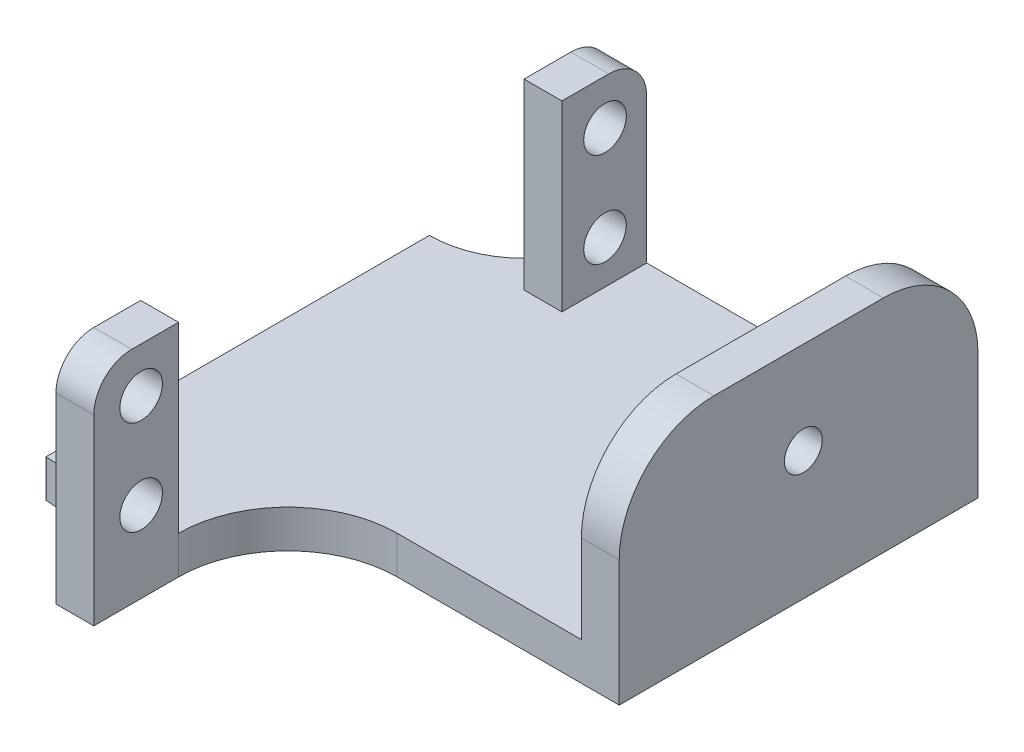
ISO-10303-21;
HEADER;
FILE_DESCRIPTION(('STEP AP214'),'2;1');
FILE_NAME('part.step','',(''),(''),'','','');
FILE_SCHEMA(('AUTOMOTIVE_DESIGN { 1 0 10303 214 1 1 1 1 }'));
ENDSEC;
DATA;
#1=APPLICATION_CONTEXT('core data for automotive mechanical design processes');
#2=APPLICATION_PROTOCOL_DEFINITION('international standard','automotive_design',2000,#1);
#3=PRODUCT_CONTEXT('',#1,'mechanical');
#4=PRODUCT('Part','Part','',(#3));
#5=PRODUCT_RELATED_PRODUCT_CATEGORY('part','',(#4));
#6=PRODUCT_DEFINITION_FORMATION('','',#4);
#7=PRODUCT_DEFINITION_CONTEXT('part definition',#1,'design');
#8=PRODUCT_DEFINITION('design','',#6,#7);
#9=PRODUCT_DEFINITION_SHAPE('','',#8);
#10=(LENGTH_UNIT() NAMED_UNIT(*) SI_UNIT(.MILLI.,.METRE.));
#11=(NAMED_UNIT(*) PLANE_ANGLE_UNIT() SI_UNIT($,.RADIAN.));
#12=(NAMED_UNIT(*) SI_UNIT($,.STERADIAN.) SOLID_ANGLE_UNIT());
#13=UNCERTAINTY_MEASURE_WITH_UNIT(LENGTH_MEASURE(1.E-05),#10,'distance_accuracy_value','');
#14=(GEOMETRIC_REPRESENTATION_CONTEXT(3) GLOBAL_UNCERTAINTY_ASSIGNED_CONTEXT((#13)) GLOBAL_UNIT_ASSIGNED_CONTEXT((#10,
#11,#12)) REPRESENTATION_CONTEXT('',''));
#15=CARTESIAN_POINT('',(0.,0.,0.));
#16=DIRECTION('',(0.,0.,1.));
#17=DIRECTION('',(1.,0.,0.));
#18=AXIS2_PLACEMENT_3D('',#15,#16,#17);
#19=CARTESIAN_POINT('',(0.,4.,0.));
#20=DIRECTION('',(0.,-1.,0.));
#21=DIRECTION('',(0.,0.,-1.));
#22=AXIS2_PLACEMENT_3D('',#19,#20,#21);
#23=PLANE('',#22);
#24=CARTESIAN_POINT('',(-23.45,4.,-8.95));
#25=DIRECTION('',(0.,-1.,0.));
#26=DIRECTION('',(0.,0.,-1.));
#27=AXIS2_PLACEMENT_3D('',#24,#25,#26);
#28=CIRCLE('',#27,11.55);
#29=CARTESIAN_POINT('',(-23.45,4.,-20.5));
#30=VERTEX_POINT('',#29);
#31=CARTESIAN_POINT('',(-35.,4.,-8.95));
#32=VERTEX_POINT('',#31);
#33=EDGE_CURVE('E437',#30,#32,#28,.F.);
#34=ORIENTED_EDGE('',*,*,#33,.F.);
#35=DIRECTION('',(-1.,0.,0.));
#36=VECTOR('',#35,1.);
#37=CARTESIAN_POINT('',(0.,4.,-20.5));
#38=LINE('',#37,#36);
#39=CARTESIAN_POINT('',(-4.,4.,-20.5));
#40=VERTEX_POINT('',#39);
#41=EDGE_CURVE('E211',#40,#30,#38,.T.);
#42=ORIENTED_EDGE('',*,*,#41,.F.);
#43=DIRECTION('',(0.,0.,-1.));
#44=VECTOR('',#43,1.);
#45=CARTESIAN_POINT('',(-4.,4.,0.));
#46=LINE('',#45,#44);
#47=CARTESIAN_POINT('',(-4.,4.,-58.4));
#48=VERTEX_POINT('',#47);
#49=EDGE_CURVE('E333',#40,#48,#46,.T.);
#50=ORIENTED_EDGE('',*,*,#49,.T.);
#51=DIRECTION('',(-1.,0.,0.));
#52=VECTOR('',#51,1.);
#53=CARTESIAN_POINT('',(-39.,4.,-58.4));
#54=LINE('',#53,#52);
#55=CARTESIAN_POINT('',(-35.,4.,-58.4));
#56=VERTEX_POINT('',#55);
#57=EDGE_CURVE('E401',#48,#56,#54,.T.);
#58=ORIENTED_EDGE('',*,*,#57,.T.);
#59=DIRECTION('',(0.,0.,1.));
#60=VECTOR('',#59,1.);
#61=CARTESIAN_POINT('',(-35.,4.,-58.4));
#62=LINE('',#61,#60);
#63=CARTESIAN_POINT('',(-35.,4.,-49.45));
#64=VERTEX_POINT('',#63);
#65=EDGE_CURVE('E352',#56,#64,#62,.T.);
#66=ORIENTED_EDGE('',*,*,#65,.T.);
#67=DIRECTION('',(-1.,0.,0.));
#68=VECTOR('',#67,1.);
#69=CARTESIAN_POINT('',(-35.,4.,-49.45));
#70=LINE('',#69,#68);
#71=CARTESIAN_POINT('',(-39.,4.,-49.45));
#72=VERTEX_POINT('',#71);
#73=EDGE_CURVE('E361',#64,#72,#70,.T.);
#74=ORIENTED_EDGE('',*,*,#73,.T.);
#75=DIRECTION('',(0.,0.,1.));
#76=VECTOR('',#75,1.);
#77=CARTESIAN_POINT('',(-39.,4.,0.));
#78=LINE('',#77,#76);
#79=CARTESIAN_POINT('',(-39.,4.,-58.4));
#80=VERTEX_POINT('',#79);
#81=EDGE_CURVE('E255',#80,#72,#78,.T.);
#82=ORIENTED_EDGE('',*,*,#81,.F.);
#83=CARTESIAN_POINT('',(-48.9447222183428,4.,-59.45));
#84=DIRECTION('',(0.,-1.,0.));
#85=DIRECTION('',(0.,0.,-1.));
#86=AXIS2_PLACEMENT_3D('',#83,#84,#85);
#87=CIRCLE('',#86,10.);
#88=CARTESIAN_POINT('',(-48.9447222183428,4.,-49.45));
#89=VERTEX_POINT('',#88);
#90=EDGE_CURVE('E264',#80,#89,#87,.T.);
#91=ORIENTED_EDGE('',*,*,#90,.T.);
#92=DIRECTION('',(-1.,0.,0.));
#93=VECTOR('',#92,1.);
#94=CARTESIAN_POINT('',(-49.,4.,-49.45));
#95=LINE('',#94,#93);
#96=CARTESIAN_POINT('',(-49.,4.,-49.45));
#97=VERTEX_POINT('',#96);
#98=EDGE_CURVE('E237',#89,#97,#95,.T.);
#99=ORIENTED_EDGE('',*,*,#98,.T.);
#100=DIRECTION('',(0.,0.,1.));
#101=VECTOR('',#100,1.);
#102=CARTESIAN_POINT('',(-49.,4.,-8.94999999999999));
#103=LINE('',#102,#101);
#104=CARTESIAN_POINT('',(-49.,4.,-8.94999999999999));
#105=VERTEX_POINT('',#104);
#106=EDGE_CURVE('E232',#97,#105,#103,.T.);
#107=ORIENTED_EDGE('',*,*,#106,.T.);
#108=DIRECTION('',(1.,0.,0.));
#109=VECTOR('',#108,1.);
#110=CARTESIAN_POINT('',(-39.,4.,-8.95));
#111=LINE('',#110,#109);
#112=CARTESIAN_POINT('',(-48.9447222183428,4.,-8.94999999999999));
#113=VERTEX_POINT('',#112);
#114=EDGE_CURVE('E398',#105,#113,#111,.T.);
#115=ORIENTED_EDGE('',*,*,#114,.T.);
#116=CARTESIAN_POINT('',(-48.9447222183428,4.,1.05000000000001));
#117=DIRECTION('',(0.,-1.,0.));
#118=DIRECTION('',(0.,0.,-1.));
#119=AXIS2_PLACEMENT_3D('',#116,#117,#118);
#120=CIRCLE('',#119,10.);
#121=CARTESIAN_POINT('',(-39.,4.,0.));
#122=VERTEX_POINT('',#121);
#123=EDGE_CURVE('E259',#113,#122,#120,.T.);
#124=ORIENTED_EDGE('',*,*,#123,.T.);
#125=DIRECTION('',(0.,0.,1.));
#126=VECTOR('',#125,1.);
#127=CARTESIAN_POINT('',(-39.,4.,0.));
#128=LINE('',#127,#126);
#129=CARTESIAN_POINT('',(-39.,4.,-8.95));
#130=VERTEX_POINT('',#129);
#131=EDGE_CURVE('E247',#130,#122,#128,.T.);
#132=ORIENTED_EDGE('',*,*,#131,.F.);
#133=DIRECTION('',(-1.,0.,0.));
#134=VECTOR('',#133,1.);
#135=CARTESIAN_POINT('',(-35.,4.,-8.95));
#136=LINE('',#135,#134);
#137=EDGE_CURVE('E387',#32,#130,#136,.T.);
#138=ORIENTED_EDGE('',*,*,#137,.F.);
#139=EDGE_LOOP('',(#34,#42,#50,#58,#66,#74,#82,#91,#99,#107,#115,#124,#132,#138));
#140=FACE_BOUND('',#139,.T.);
#141=ADVANCED_FACE('F34',(#140),#23,.F.);
#142=CARTESIAN_POINT('',(-49.,4.,-8.94999999999999));
#143=DIRECTION('',(1.,0.,0.));
#144=DIRECTION('',(0.,0.,-1.));
#145=AXIS2_PLACEMENT_3D('',#142,#143,#144);
#146=PLANE('',#145);
#147=DIRECTION('',(0.,0.,1.));
#148=VECTOR('',#147,1.);
#149=CARTESIAN_POINT('',(-49.,0.,-8.94999999999999));
#150=LINE('',#149,#148);
#151=CARTESIAN_POINT('',(-49.,0.,-49.45));
#152=VERTEX_POINT('',#151);
#153=CARTESIAN_POINT('',(-49.,0.,-8.94999999999999));
#154=VERTEX_POINT('',#153);
#155=EDGE_CURVE('E224',#152,#154,#150,.T.);
#156=ORIENTED_EDGE('',*,*,#155,.T.);
#157=DIRECTION('',(0.,-1.,0.));
#158=VECTOR('',#157,1.);
#159=CARTESIAN_POINT('',(-49.,4.,-8.94999999999999));
#160=LINE('',#159,#158);
#161=EDGE_CURVE('E244',#105,#154,#160,.T.);
#162=ORIENTED_EDGE('',*,*,#161,.F.);
#163=ORIENTED_EDGE('',*,*,#106,.F.);
#164=DIRECTION('',(0.,-1.,0.));
#165=VECTOR('',#164,1.);
#166=CARTESIAN_POINT('',(-49.,4.,-49.45));
#167=LINE('',#166,#165);
#168=EDGE_CURVE('E233',#97,#152,#167,.T.);
#169=ORIENTED_EDGE('',*,*,#168,.T.);
#170=EDGE_LOOP('',(#156,#162,#163,#169));
#171=FACE_BOUND('',#170,.T.);
#172=ADVANCED_FACE('F407',(#171),#146,.F.);
#173=CARTESIAN_POINT('',(-39.,4.,-8.95));
#174=DIRECTION('',(0.,0.,-1.));
#175=DIRECTION('',(-1.,0.,0.));
#176=AXIS2_PLACEMENT_3D('',#173,#174,#175);
#177=PLANE('',#176);
#178=DIRECTION('',(1.,0.,0.));
#179=VECTOR('',#178,1.);
#180=CARTESIAN_POINT('',(-39.,0.,-8.95));
#181=LINE('',#180,#179);
#182=CARTESIAN_POINT('',(-48.9447222183428,0.,-8.94999999999999));
#183=VERTEX_POINT('',#182);
#184=EDGE_CURVE('E218',#154,#183,#181,.T.);
#185=ORIENTED_EDGE('',*,*,#184,.T.);
#186=DIRECTION('',(0.,1.,0.));
#187=VECTOR('',#186,1.);
#188=CARTESIAN_POINT('',(-48.9447222183428,4.,-8.94999999999999));
#189=LINE('',#188,#187);
#190=EDGE_CURVE('E250',#183,#113,#189,.T.);
#191=ORIENTED_EDGE('',*,*,#190,.T.);
#192=ORIENTED_EDGE('',*,*,#114,.F.);
#193=ORIENTED_EDGE('',*,*,#161,.T.);
#194=EDGE_LOOP('',(#185,#191,#192,#193));
#195=FACE_BOUND('',#194,.T.);
#196=ADVANCED_FACE('F413',(#195),#177,.F.);
#197=CARTESIAN_POINT('',(-39.,4.,0.));
#198=DIRECTION('',(1.,0.,0.));
#199=DIRECTION('',(0.,0.,-1.));
#200=AXIS2_PLACEMENT_3D('',#197,#198,#199);
#201=PLANE('',#200);
#202=DIRECTION('',(0.,-1.,0.));
#203=VECTOR('',#202,1.);
#204=CARTESIAN_POINT('',(-39.,4.,0.));
#205=LINE('',#204,#203);
#206=CARTESIAN_POINT('',(-39.,19.3,0.));
#207=VERTEX_POINT('',#206);
#208=EDGE_CURVE('E242',#207,#122,#205,.T.);
#209=ORIENTED_EDGE('',*,*,#208,.F.);
#210=CARTESIAN_POINT('',(-39.,19.3,-3.99999999999999));
#211=DIRECTION('',(1.,0.,0.));
#212=DIRECTION('',(0.,0.,-1.));
#213=AXIS2_PLACEMENT_3D('',#210,#211,#212);
#214=CIRCLE('',#213,4.);
#215=CARTESIAN_POINT('',(-39.,23.3,-3.99999999999999));
#216=VERTEX_POINT('',#215);
#217=EDGE_CURVE('E277',#207,#216,#214,.F.);
#218=ORIENTED_EDGE('',*,*,#217,.T.);
#219=DIRECTION('',(0.,0.,-1.));
#220=VECTOR('',#219,1.);
#221=CARTESIAN_POINT('',(-39.,23.3,-8.95));
#222=LINE('',#221,#220);
#223=CARTESIAN_POINT('',(-39.,23.3,-8.95));
#224=VERTEX_POINT('',#223);
#225=EDGE_CURVE('E384',#216,#224,#222,.T.);
#226=ORIENTED_EDGE('',*,*,#225,.T.);
#227=DIRECTION('',(0.,-1.,0.));
#228=VECTOR('',#227,1.);
#229=CARTESIAN_POINT('',(-39.,23.3,-8.95));
#230=LINE('',#229,#228);
#231=EDGE_CURVE('E380',#224,#130,#230,.T.);
#232=ORIENTED_EDGE('',*,*,#231,.T.);
#233=ORIENTED_EDGE('',*,*,#131,.T.);
#234=EDGE_LOOP('',(#209,#218,#226,#232,#233));
#235=FACE_BOUND('',#234,.T.);
#236=CARTESIAN_POINT('',(-39.,8.55,-4.99999999999999));
#237=DIRECTION('',(-1.,0.,0.));
#238=DIRECTION('',(0.,0.,1.));
#239=AXIS2_PLACEMENT_3D('',#236,#237,#238);
#240=CIRCLE('',#239,2.25);
#241=CARTESIAN_POINT('',(-39.,8.55,-2.74999999999999));
#242=VERTEX_POINT('',#241);
#243=EDGE_CURVE('E368',#242,#242,#240,.T.);
#244=ORIENTED_EDGE('',*,*,#243,.F.);
#245=EDGE_LOOP('',(#244));
#246=FACE_BOUND('',#245,.T.);
#247=CARTESIAN_POINT('',(-39.,18.55,-4.99999999999999));
#248=DIRECTION('',(-1.,0.,0.));
#249=DIRECTION('',(0.,0.,1.));
#250=AXIS2_PLACEMENT_3D('',#247,#248,#249);
#251=CIRCLE('',#250,2.25);
#252=CARTESIAN_POINT('',(-39.,18.55,-2.74999999999999));
#253=VERTEX_POINT('',#252);
#254=EDGE_CURVE('E374',#253,#253,#251,.T.);
#255=ORIENTED_EDGE('',*,*,#254,.F.);
#256=EDGE_LOOP('',(#255));
#257=FACE_BOUND('',#256,.T.);
#258=ADVANCED_FACE('F449',(#235,#246,#257),#201,.F.);
#259=CARTESIAN_POINT('',(0.,4.,0.));
#260=DIRECTION('',(0.,0.,-1.));
#261=DIRECTION('',(-1.,0.,0.));
#262=AXIS2_PLACEMENT_3D('',#259,#260,#261);
#263=PLANE('',#262);
#264=DIRECTION('',(1.,0.,0.));
#265=VECTOR('',#264,1.);
#266=CARTESIAN_POINT('',(0.,0.,0.));
#267=LINE('',#266,#265);
#268=CARTESIAN_POINT('',(-39.,0.,0.));
#269=VERTEX_POINT('',#268);
#270=CARTESIAN_POINT('',(-35.,0.,0.));
#271=VERTEX_POINT('',#270);
#272=EDGE_CURVE('E208',#269,#271,#267,.T.);
#273=ORIENTED_EDGE('',*,*,#272,.T.);
#274=DIRECTION('',(0.,1.,0.));
#275=VECTOR('',#274,1.);
#276=CARTESIAN_POINT('',(-35.,23.3,0.));
#277=LINE('',#276,#275);
#278=CARTESIAN_POINT('',(-35.,19.3,0.));
#279=VERTEX_POINT('',#278);
#280=EDGE_CURVE('E189',#271,#279,#277,.T.);
#281=ORIENTED_EDGE('',*,*,#280,.T.);
#282=DIRECTION('',(-1.,0.,0.));
#283=VECTOR('',#282,1.);
#284=CARTESIAN_POINT('',(-39.,19.3,0.));
#285=LINE('',#284,#283);
#286=EDGE_CURVE('E275',#279,#207,#285,.T.);
#287=ORIENTED_EDGE('',*,*,#286,.T.);
#288=ORIENTED_EDGE('',*,*,#208,.T.);
#289=EDGE_CURVE('E216',#122,#269,#205,.T.);
#290=ORIENTED_EDGE('',*,*,#289,.T.);
#291=EDGE_LOOP('',(#273,#281,#287,#288,#290));
#292=FACE_BOUND('',#291,.T.);
#293=ADVANCED_FACE('F214',(#292),#263,.F.);
#294=CARTESIAN_POINT('',(0.,4.,-58.4));
#295=DIRECTION('',(-1.,0.,0.));
#296=DIRECTION('',(0.,0.,1.));
#297=AXIS2_PLACEMENT_3D('',#294,#295,#296);
#298=PLANE('',#297);
#299=DIRECTION('',(0.,0.,1.));
#300=VECTOR('',#299,1.);
#301=CARTESIAN_POINT('',(0.,23.3,0.));
#302=LINE('',#301,#300);
#303=CARTESIAN_POINT('',(0.,23.3,-48.4));
#304=VERTEX_POINT('',#303);
#305=CARTESIAN_POINT('',(0.,23.3,-30.5));
#306=VERTEX_POINT('',#305);
#307=EDGE_CURVE('E314',#304,#306,#302,.T.);
#308=ORIENTED_EDGE('',*,*,#307,.T.);
#309=CARTESIAN_POINT('',(0.,13.3,-30.5));
#310=DIRECTION('',(-1.,0.,0.));
#311=DIRECTION('',(0.,0.,1.));
#312=AXIS2_PLACEMENT_3D('',#309,#310,#311);
#313=CIRCLE('',#312,10.);
#314=CARTESIAN_POINT('',(0.,13.3,-20.5));
#315=VERTEX_POINT('',#314);
#316=EDGE_CURVE('E289',#306,#315,#313,.F.);
#317=ORIENTED_EDGE('',*,*,#316,.T.);
#318=DIRECTION('',(0.,-1.,0.));
#319=VECTOR('',#318,1.);
#320=CARTESIAN_POINT('',(0.,23.301,-20.5));
#321=LINE('',#320,#319);
#322=CARTESIAN_POINT('',(0.,0.,-20.5));
#323=VERTEX_POINT('',#322);
#324=EDGE_CURVE('E312',#315,#323,#321,.T.);
#325=ORIENTED_EDGE('',*,*,#324,.T.);
#326=DIRECTION('',(0.,0.,-1.));
#327=VECTOR('',#326,1.);
#328=CARTESIAN_POINT('',(0.,0.,-58.4));
#329=LINE('',#328,#327);
#330=CARTESIAN_POINT('',(0.,0.,-58.4));
#331=VERTEX_POINT('',#330);
#332=EDGE_CURVE('E217',#323,#331,#329,.T.);
#333=ORIENTED_EDGE('',*,*,#332,.T.);
#334=DIRECTION('',(0.,-1.,0.));
#335=VECTOR('',#334,1.);
#336=CARTESIAN_POINT('',(0.,4.,-58.4));
#337=LINE('',#336,#335);
#338=CARTESIAN_POINT('',(0.,13.3,-58.4));
#339=VERTEX_POINT('',#338);
#340=EDGE_CURVE('E240',#339,#331,#337,.T.);
#341=ORIENTED_EDGE('',*,*,#340,.F.);
#342=CARTESIAN_POINT('',(0.,13.3,-48.4));
#343=DIRECTION('',(-1.,0.,0.));
#344=DIRECTION('',(0.,0.,1.));
#345=AXIS2_PLACEMENT_3D('',#342,#343,#344);
#346=CIRCLE('',#345,10.);
#347=EDGE_CURVE('E287',#339,#304,#346,.F.);
#348=ORIENTED_EDGE('',*,*,#347,.T.);
#349=EDGE_LOOP('',(#308,#317,#325,#333,#341,#348));
#350=FACE_BOUND('',#349,.T.);
#351=CARTESIAN_POINT('',(0.,13.55,-39.95));
#352=DIRECTION('',(1.,0.,0.));
#353=DIRECTION('',(0.,0.,-1.));
#354=AXIS2_PLACEMENT_3D('',#351,#352,#353);
#355=CIRCLE('',#354,2.);
#356=CARTESIAN_POINT('',(0.,13.55,-41.95));
#357=VERTEX_POINT('',#356);
#358=EDGE_CURVE('E320',#357,#357,#355,.T.);
#359=ORIENTED_EDGE('',*,*,#358,.F.);
#360=EDGE_LOOP('',(#359));
#361=FACE_BOUND('',#360,.T.);
#362=ADVANCED_FACE('F310',(#350,#361),#298,.F.);
#363=CARTESIAN_POINT('',(-39.,4.,-58.4));
#364=DIRECTION('',(0.,0.,1.));
#365=DIRECTION('',(1.,0.,0.));
#366=AXIS2_PLACEMENT_3D('',#363,#364,#365);
#367=PLANE('',#366);
#368=DIRECTION('',(0.,1.,0.));
#369=VECTOR('',#368,1.);
#370=CARTESIAN_POINT('',(-4.,23.3,-58.4));
#371=LINE('',#370,#369);
#372=CARTESIAN_POINT('',(-4.,13.3,-58.4));
#373=VERTEX_POINT('',#372);
#374=EDGE_CURVE('E306',#48,#373,#371,.T.);
#375=ORIENTED_EDGE('',*,*,#374,.T.);
#376=DIRECTION('',(1.,0.,0.));
#377=VECTOR('',#376,1.);
#378=CARTESIAN_POINT('',(0.,13.3,-58.4));
#379=LINE('',#378,#377);
#380=EDGE_CURVE('E11',#373,#339,#379,.T.);
#381=ORIENTED_EDGE('',*,*,#380,.T.);
#382=ORIENTED_EDGE('',*,*,#340,.T.);
#383=DIRECTION('',(-1.,0.,0.));
#384=VECTOR('',#383,1.);
#385=CARTESIAN_POINT('',(-39.,0.,-58.4));
#386=LINE('',#385,#384);
#387=CARTESIAN_POINT('',(-39.,0.,-58.4));
#388=VERTEX_POINT('',#387);
#389=EDGE_CURVE('E221',#331,#388,#386,.T.);
#390=ORIENTED_EDGE('',*,*,#389,.T.);
#391=DIRECTION('',(0.,-1.,0.));
#392=VECTOR('',#391,1.);
#393=CARTESIAN_POINT('',(-39.,4.,-58.4));
#394=LINE('',#393,#392);
#395=EDGE_CURVE('E236',#80,#388,#394,.T.);
#396=ORIENTED_EDGE('',*,*,#395,.F.);
#397=CARTESIAN_POINT('',(-39.,19.3,-58.4));
#398=VERTEX_POINT('',#397);
#399=EDGE_CURVE('E238',#398,#80,#394,.T.);
#400=ORIENTED_EDGE('',*,*,#399,.F.);
#401=DIRECTION('',(-1.,0.,0.));
#402=VECTOR('',#401,1.);
#403=CARTESIAN_POINT('',(-35.,19.3,-58.4));
#404=LINE('',#403,#402);
#405=CARTESIAN_POINT('',(-35.,19.3,-58.4));
#406=VERTEX_POINT('',#405);
#407=EDGE_CURVE('E271',#398,#406,#404,.F.);
#408=ORIENTED_EDGE('',*,*,#407,.T.);
#409=DIRECTION('',(0.,-1.,0.));
#410=VECTOR('',#409,1.);
#411=CARTESIAN_POINT('',(-35.,23.3,-58.4));
#412=LINE('',#411,#410);
#413=EDGE_CURVE('E349',#406,#56,#412,.T.);
#414=ORIENTED_EDGE('',*,*,#413,.T.);
#415=ORIENTED_EDGE('',*,*,#57,.F.);
#416=EDGE_LOOP('',(#375,#381,#382,#390,#396,#400,#408,#414,#415));
#417=FACE_BOUND('',#416,.T.);
#418=ADVANCED_FACE('F429',(#417),#367,.F.);
#419=CARTESIAN_POINT('',(-39.,4.,-49.45));
#420=DIRECTION('',(1.,0.,0.));
#421=DIRECTION('',(0.,0.,-1.));
#422=AXIS2_PLACEMENT_3D('',#419,#420,#421);
#423=PLANE('',#422);
#424=DIRECTION('',(0.,0.,-1.));
#425=VECTOR('',#424,1.);
#426=CARTESIAN_POINT('',(-39.,23.3,-58.4));
#427=LINE('',#426,#425);
#428=CARTESIAN_POINT('',(-39.,23.3,-49.45));
#429=VERTEX_POINT('',#428);
#430=CARTESIAN_POINT('',(-39.,23.3,-54.4));
#431=VERTEX_POINT('',#430);
#432=EDGE_CURVE('E353',#429,#431,#427,.T.);
#433=ORIENTED_EDGE('',*,*,#432,.T.);
#434=CARTESIAN_POINT('',(-39.,19.3,-54.4));
#435=DIRECTION('',(1.,0.,0.));
#436=DIRECTION('',(0.,0.,-1.));
#437=AXIS2_PLACEMENT_3D('',#434,#435,#436);
#438=CIRCLE('',#437,4.);
#439=EDGE_CURVE('E269',#431,#398,#438,.F.);
#440=ORIENTED_EDGE('',*,*,#439,.T.);
#441=ORIENTED_EDGE('',*,*,#399,.T.);
#442=ORIENTED_EDGE('',*,*,#81,.T.);
#443=DIRECTION('',(0.,1.,0.));
#444=VECTOR('',#443,1.);
#445=CARTESIAN_POINT('',(-39.,23.3,-49.45));
#446=LINE('',#445,#444);
#447=EDGE_CURVE('E346',#72,#429,#446,.T.);
#448=ORIENTED_EDGE('',*,*,#447,.T.);
#449=EDGE_LOOP('',(#433,#440,#441,#442,#448));
#450=FACE_BOUND('',#449,.T.);
#451=CARTESIAN_POINT('',(-39.,8.55,-54.));
#452=DIRECTION('',(-1.,0.,0.));
#453=DIRECTION('',(0.,0.,1.));
#454=AXIS2_PLACEMENT_3D('',#451,#452,#453);
#455=CIRCLE('',#454,2.25);
#456=CARTESIAN_POINT('',(-39.,8.55,-51.75));
#457=VERTEX_POINT('',#456);
#458=EDGE_CURVE('E305',#457,#457,#455,.T.);
#459=ORIENTED_EDGE('',*,*,#458,.F.);
#460=EDGE_LOOP('',(#459));
#461=FACE_BOUND('',#460,.T.);
#462=CARTESIAN_POINT('',(-39.,18.55,-54.));
#463=DIRECTION('',(-1.,0.,0.));
#464=DIRECTION('',(0.,0.,1.));
#465=AXIS2_PLACEMENT_3D('',#462,#463,#464);
#466=CIRCLE('',#465,2.25);
#467=CARTESIAN_POINT('',(-39.,18.55,-51.75));
#468=VERTEX_POINT('',#467);
#469=EDGE_CURVE('E340',#468,#468,#466,.T.);
#470=ORIENTED_EDGE('',*,*,#469,.F.);
#471=EDGE_LOOP('',(#470));
#472=FACE_BOUND('',#471,.T.);
#473=ADVANCED_FACE('F480',(#450,#461,#472),#423,.F.);
#474=CARTESIAN_POINT('',(-49.,4.,-49.45));
#475=DIRECTION('',(0.,0.,1.));
#476=DIRECTION('',(1.,0.,0.));
#477=AXIS2_PLACEMENT_3D('',#474,#475,#476);
#478=PLANE('',#477);
#479=ORIENTED_EDGE('',*,*,#98,.F.);
#480=DIRECTION('',(0.,-1.,0.));
#481=VECTOR('',#480,1.);
#482=CARTESIAN_POINT('',(-48.9447222183428,4.,-49.45));
#483=LINE('',#482,#481);
#484=CARTESIAN_POINT('',(-48.9447222183428,0.,-49.45));
#485=VERTEX_POINT('',#484);
#486=EDGE_CURVE('E252',#89,#485,#483,.T.);
#487=ORIENTED_EDGE('',*,*,#486,.T.);
#488=DIRECTION('',(-1.,0.,0.));
#489=VECTOR('',#488,1.);
#490=CARTESIAN_POINT('',(-49.,0.,-49.45));
#491=LINE('',#490,#489);
#492=EDGE_CURVE('E230',#485,#152,#491,.T.);
#493=ORIENTED_EDGE('',*,*,#492,.T.);
#494=ORIENTED_EDGE('',*,*,#168,.F.);
#495=EDGE_LOOP('',(#479,#487,#493,#494));
#496=FACE_BOUND('',#495,.T.);
#497=ADVANCED_FACE('F422',(#496),#478,.F.);
#498=CARTESIAN_POINT('',(0.,0.,0.));
#499=DIRECTION('',(0.,-1.,0.));
#500=DIRECTION('',(0.,0.,-1.));
#501=AXIS2_PLACEMENT_3D('',#498,#499,#500);
#502=PLANE('',#501);
#503=DIRECTION('',(1.,0.,0.));
#504=VECTOR('',#503,1.);
#505=CARTESIAN_POINT('',(0.,0.,-20.5));
#506=LINE('',#505,#504);
#507=CARTESIAN_POINT('',(-23.45,0.,-20.5));
#508=VERTEX_POINT('',#507);
#509=EDGE_CURVE('E316',#508,#323,#506,.T.);
#510=ORIENTED_EDGE('',*,*,#509,.F.);
#511=CARTESIAN_POINT('',(-23.45,0.,-8.95));
#512=DIRECTION('',(0.,-1.,0.));
#513=DIRECTION('',(0.,0.,-1.));
#514=AXIS2_PLACEMENT_3D('',#511,#512,#513);
#515=CIRCLE('',#514,11.55);
#516=CARTESIAN_POINT('',(-35.,0.,-8.95));
#517=VERTEX_POINT('',#516);
#518=EDGE_CURVE('E210',#517,#508,#515,.T.);
#519=ORIENTED_EDGE('',*,*,#518,.F.);
#520=DIRECTION('',(0.,0.,-1.));
#521=VECTOR('',#520,1.);
#522=CARTESIAN_POINT('',(-35.,0.,0.));
#523=LINE('',#522,#521);
#524=EDGE_CURVE('E193',#271,#517,#523,.T.);
#525=ORIENTED_EDGE('',*,*,#524,.F.);
#526=ORIENTED_EDGE('',*,*,#272,.F.);
#527=CARTESIAN_POINT('',(-48.9447222183428,0.,1.05000000000001));
#528=DIRECTION('',(0.,-1.,0.));
#529=DIRECTION('',(0.,0.,-1.));
#530=AXIS2_PLACEMENT_3D('',#527,#528,#529);
#531=CIRCLE('',#530,10.);
#532=EDGE_CURVE('E257',#269,#183,#531,.F.);
#533=ORIENTED_EDGE('',*,*,#532,.T.);
#534=ORIENTED_EDGE('',*,*,#184,.F.);
#535=ORIENTED_EDGE('',*,*,#155,.F.);
#536=ORIENTED_EDGE('',*,*,#492,.F.);
#537=CARTESIAN_POINT('',(-48.9447222183428,0.,-59.45));
#538=DIRECTION('',(0.,-1.,0.));
#539=DIRECTION('',(0.,0.,-1.));
#540=AXIS2_PLACEMENT_3D('',#537,#538,#539);
#541=CIRCLE('',#540,10.);
#542=EDGE_CURVE('E262',#485,#388,#541,.F.);
#543=ORIENTED_EDGE('',*,*,#542,.T.);
#544=ORIENTED_EDGE('',*,*,#389,.F.);
#545=ORIENTED_EDGE('',*,*,#332,.F.);
#546=EDGE_LOOP('',(#510,#519,#525,#526,#533,#534,#535,#536,#543,#544,#545));
#547=FACE_BOUND('',#546,.T.);
#548=ADVANCED_FACE('F207',(#547),#502,.T.);
#549=CARTESIAN_POINT('',(-35.,23.3,-8.95));
#550=DIRECTION('',(0.,0.,-1.));
#551=DIRECTION('',(0.,1.,0.));
#552=AXIS2_PLACEMENT_3D('',#549,#550,#551);
#553=PLANE('',#552);
#554=ORIENTED_EDGE('',*,*,#231,.F.);
#555=DIRECTION('',(-1.,0.,0.));
#556=VECTOR('',#555,1.);
#557=CARTESIAN_POINT('',(-35.,23.3,-8.95));
#558=LINE('',#557,#556);
#559=CARTESIAN_POINT('',(-35.,23.3,-8.95));
#560=VERTEX_POINT('',#559);
#561=EDGE_CURVE('E391',#560,#224,#558,.T.);
#562=ORIENTED_EDGE('',*,*,#561,.F.);
#563=DIRECTION('',(0.,-1.,0.));
#564=VECTOR('',#563,1.);
#565=CARTESIAN_POINT('',(-35.,23.3,-8.95));
#566=LINE('',#565,#564);
#567=EDGE_CURVE('E202',#560,#32,#566,.T.);
#568=ORIENTED_EDGE('',*,*,#567,.T.);
#569=ORIENTED_EDGE('',*,*,#137,.T.);
#570=EDGE_LOOP('',(#554,#562,#568,#569));
#571=FACE_BOUND('',#570,.T.);
#572=ADVANCED_FACE('F446',(#571),#553,.T.);
#573=CARTESIAN_POINT('',(-35.,23.3,-8.95));
#574=DIRECTION('',(0.,1.,0.));
#575=DIRECTION('',(0.,0.,1.));
#576=AXIS2_PLACEMENT_3D('',#573,#574,#575);
#577=PLANE('',#576);
#578=ORIENTED_EDGE('',*,*,#225,.F.);
#579=DIRECTION('',(-1.,0.,0.));
#580=VECTOR('',#579,1.);
#581=CARTESIAN_POINT('',(-35.,23.3,-4.));
#582=LINE('',#581,#580);
#583=CARTESIAN_POINT('',(-35.,23.3,-4.));
#584=VERTEX_POINT('',#583);
#585=EDGE_CURVE('E279',#216,#584,#582,.F.);
#586=ORIENTED_EDGE('',*,*,#585,.T.);
#587=DIRECTION('',(0.,0.,-1.));
#588=VECTOR('',#587,1.);
#589=CARTESIAN_POINT('',(-35.,23.3,-8.95));
#590=LINE('',#589,#588);
#591=EDGE_CURVE('E201',#584,#560,#590,.T.);
#592=ORIENTED_EDGE('',*,*,#591,.T.);
#593=ORIENTED_EDGE('',*,*,#561,.T.);
#594=EDGE_LOOP('',(#578,#586,#592,#593));
#595=FACE_BOUND('',#594,.T.);
#596=ADVANCED_FACE('F454',(#595),#577,.T.);
#597=CARTESIAN_POINT('',(-35.,0.,0.));
#598=DIRECTION('',(-1.,0.,0.));
#599=DIRECTION('',(0.,0.,1.));
#600=AXIS2_PLACEMENT_3D('',#597,#598,#599);
#601=PLANE('',#600);
#602=CARTESIAN_POINT('',(-35.,8.55,-4.99999999999999));
#603=DIRECTION('',(-1.,0.,0.));
#604=DIRECTION('',(0.,0.,1.));
#605=AXIS2_PLACEMENT_3D('',#602,#603,#604);
#606=CIRCLE('',#605,2.25);
#607=CARTESIAN_POINT('',(-35.,8.55,-2.74999999999999));
#608=VERTEX_POINT('',#607);
#609=EDGE_CURVE('E371',#608,#608,#606,.T.);
#610=ORIENTED_EDGE('',*,*,#609,.T.);
#611=EDGE_LOOP('',(#610));
#612=FACE_BOUND('',#611,.T.);
#613=CARTESIAN_POINT('',(-35.,18.55,-4.99999999999999));
#614=DIRECTION('',(-1.,0.,0.));
#615=DIRECTION('',(0.,0.,1.));
#616=AXIS2_PLACEMENT_3D('',#613,#614,#615);
#617=CIRCLE('',#616,2.25);
#618=CARTESIAN_POINT('',(-35.,18.55,-2.74999999999999));
#619=VERTEX_POINT('',#618);
#620=EDGE_CURVE('E377',#619,#619,#617,.T.);
#621=ORIENTED_EDGE('',*,*,#620,.T.);
#622=EDGE_LOOP('',(#621));
#623=FACE_BOUND('',#622,.T.);
#624=ORIENTED_EDGE('',*,*,#591,.F.);
#625=CARTESIAN_POINT('',(-35.,19.3,-4.));
#626=DIRECTION('',(-1.,0.,0.));
#627=DIRECTION('',(0.,0.,1.));
#628=AXIS2_PLACEMENT_3D('',#625,#626,#627);
#629=CIRCLE('',#628,4.);
#630=EDGE_CURVE('E196',#584,#279,#629,.F.);
#631=ORIENTED_EDGE('',*,*,#630,.T.);
#632=ORIENTED_EDGE('',*,*,#280,.F.);
#633=ORIENTED_EDGE('',*,*,#524,.T.);
#634=DIRECTION('',(0.,-1.,0.));
#635=VECTOR('',#634,1.);
#636=CARTESIAN_POINT('',(-35.,23.301,-8.95));
#637=LINE('',#636,#635);
#638=EDGE_CURVE('E322',#32,#517,#637,.T.);
#639=ORIENTED_EDGE('',*,*,#638,.F.);
#640=ORIENTED_EDGE('',*,*,#567,.F.);
#641=EDGE_LOOP('',(#624,#631,#632,#633,#639,#640));
#642=FACE_BOUND('',#641,.T.);
#643=ADVANCED_FACE('F192',(#612,#623,#642),#601,.F.);
#644=CARTESIAN_POINT('',(-35.,18.55,-4.99999999999999));
#645=DIRECTION('',(-1.,0.,0.));
#646=DIRECTION('',(0.,0.,1.));
#647=AXIS2_PLACEMENT_3D('',#644,#645,#646);
#648=CYLINDRICAL_SURFACE('',#647,2.25);
#649=ORIENTED_EDGE('',*,*,#620,.F.);
#650=EDGE_LOOP('',(#649));
#651=FACE_BOUND('',#650,.T.);
#652=ORIENTED_EDGE('',*,*,#254,.T.);
#653=EDGE_LOOP('',(#652));
#654=FACE_BOUND('',#653,.T.);
#655=ADVANCED_FACE('F572',(#651,#654),#648,.F.);
#656=CARTESIAN_POINT('',(-35.,8.55,-4.99999999999999));
#657=DIRECTION('',(-1.,0.,0.));
#658=DIRECTION('',(0.,0.,1.));
#659=AXIS2_PLACEMENT_3D('',#656,#657,#658);
#660=CYLINDRICAL_SURFACE('',#659,2.25);
#661=ORIENTED_EDGE('',*,*,#609,.F.);
#662=EDGE_LOOP('',(#661));
#663=FACE_BOUND('',#662,.T.);
#664=ORIENTED_EDGE('',*,*,#243,.T.);
#665=EDGE_LOOP('',(#664));
#666=FACE_BOUND('',#665,.T.);
#667=ADVANCED_FACE('F648',(#663,#666),#660,.F.);
#668=CARTESIAN_POINT('',(-35.,23.3,-58.4));
#669=DIRECTION('',(0.,1.,0.));
#670=DIRECTION('',(0.,0.,1.));
#671=AXIS2_PLACEMENT_3D('',#668,#669,#670);
#672=PLANE('',#671);
#673=DIRECTION('',(0.,0.,-1.));
#674=VECTOR('',#673,1.);
#675=CARTESIAN_POINT('',(-35.,23.3,-58.4));
#676=LINE('',#675,#674);
#677=CARTESIAN_POINT('',(-35.,23.3,-49.45));
#678=VERTEX_POINT('',#677);
#679=CARTESIAN_POINT('',(-35.,23.3,-54.4));
#680=VERTEX_POINT('',#679);
#681=EDGE_CURVE('E358',#678,#680,#676,.T.);
#682=ORIENTED_EDGE('',*,*,#681,.T.);
#683=DIRECTION('',(-1.,0.,0.));
#684=VECTOR('',#683,1.);
#685=CARTESIAN_POINT('',(-39.,23.3,-54.4));
#686=LINE('',#685,#684);
#687=EDGE_CURVE('E266',#680,#431,#686,.T.);
#688=ORIENTED_EDGE('',*,*,#687,.T.);
#689=ORIENTED_EDGE('',*,*,#432,.F.);
#690=DIRECTION('',(-1.,0.,0.));
#691=VECTOR('',#690,1.);
#692=CARTESIAN_POINT('',(-35.,23.3,-49.45));
#693=LINE('',#692,#691);
#694=EDGE_CURVE('E366',#678,#429,#693,.T.);
#695=ORIENTED_EDGE('',*,*,#694,.F.);
#696=EDGE_LOOP('',(#682,#688,#689,#695));
#697=FACE_BOUND('',#696,.T.);
#698=ADVANCED_FACE('F645',(#697),#672,.T.);
#699=CARTESIAN_POINT('',(-35.,23.3,-49.45));
#700=DIRECTION('',(0.,0.,1.));
#701=DIRECTION('',(1.,0.,0.));
#702=AXIS2_PLACEMENT_3D('',#699,#700,#701);
#703=PLANE('',#702);
#704=ORIENTED_EDGE('',*,*,#447,.F.);
#705=ORIENTED_EDGE('',*,*,#73,.F.);
#706=DIRECTION('',(0.,1.,0.));
#707=VECTOR('',#706,1.);
#708=CARTESIAN_POINT('',(-35.,23.3,-49.45));
#709=LINE('',#708,#707);
#710=EDGE_CURVE('E355',#64,#678,#709,.T.);
#711=ORIENTED_EDGE('',*,*,#710,.T.);
#712=ORIENTED_EDGE('',*,*,#694,.T.);
#713=EDGE_LOOP('',(#704,#705,#711,#712));
#714=FACE_BOUND('',#713,.T.);
#715=ADVANCED_FACE('F643',(#714),#703,.T.);
#716=CARTESIAN_POINT('',(-35.,0.,0.));
#717=DIRECTION('',(-1.,0.,0.));
#718=DIRECTION('',(0.,0.,1.));
#719=AXIS2_PLACEMENT_3D('',#716,#717,#718);
#720=PLANE('',#719);
#721=CARTESIAN_POINT('',(-35.,8.55,-54.));
#722=DIRECTION('',(-1.,0.,0.));
#723=DIRECTION('',(0.,0.,1.));
#724=AXIS2_PLACEMENT_3D('',#721,#722,#723);
#725=CIRCLE('',#724,2.25);
#726=CARTESIAN_POINT('',(-35.,8.55,-51.75));
#727=VERTEX_POINT('',#726);
#728=EDGE_CURVE('E337',#727,#727,#725,.T.);
#729=ORIENTED_EDGE('',*,*,#728,.T.);
#730=EDGE_LOOP('',(#729));
#731=FACE_BOUND('',#730,.T.);
#732=CARTESIAN_POINT('',(-35.,18.55,-54.));
#733=DIRECTION('',(-1.,0.,0.));
#734=DIRECTION('',(0.,0.,1.));
#735=AXIS2_PLACEMENT_3D('',#732,#733,#734);
#736=CIRCLE('',#735,2.25);
#737=CARTESIAN_POINT('',(-35.,18.55,-51.75));
#738=VERTEX_POINT('',#737);
#739=EDGE_CURVE('E343',#738,#738,#736,.T.);
#740=ORIENTED_EDGE('',*,*,#739,.T.);
#741=EDGE_LOOP('',(#740));
#742=FACE_BOUND('',#741,.T.);
#743=ORIENTED_EDGE('',*,*,#413,.F.);
#744=CARTESIAN_POINT('',(-35.,19.3,-54.4));
#745=DIRECTION('',(-1.,0.,0.));
#746=DIRECTION('',(0.,0.,1.));
#747=AXIS2_PLACEMENT_3D('',#744,#745,#746);
#748=CIRCLE('',#747,4.);
#749=EDGE_CURVE('E273',#406,#680,#748,.F.);
#750=ORIENTED_EDGE('',*,*,#749,.T.);
#751=ORIENTED_EDGE('',*,*,#681,.F.);
#752=ORIENTED_EDGE('',*,*,#710,.F.);
#753=ORIENTED_EDGE('',*,*,#65,.F.);
#754=EDGE_LOOP('',(#743,#750,#751,#752,#753));
#755=FACE_BOUND('',#754,.T.);
#756=ADVANCED_FACE('F516',(#731,#742,#755),#720,.F.);
#757=CARTESIAN_POINT('',(-35.,18.55,-54.));
#758=DIRECTION('',(-1.,0.,0.));
#759=DIRECTION('',(0.,0.,1.));
#760=AXIS2_PLACEMENT_3D('',#757,#758,#759);
#761=CYLINDRICAL_SURFACE('',#760,2.25);
#762=ORIENTED_EDGE('',*,*,#739,.F.);
#763=EDGE_LOOP('',(#762));
#764=FACE_BOUND('',#763,.T.);
#765=ORIENTED_EDGE('',*,*,#469,.T.);
#766=EDGE_LOOP('',(#765));
#767=FACE_BOUND('',#766,.T.);
#768=ADVANCED_FACE('F637',(#764,#767),#761,.F.);
#769=CARTESIAN_POINT('',(-35.,8.55,-54.));
#770=DIRECTION('',(-1.,0.,0.));
#771=DIRECTION('',(0.,0.,1.));
#772=AXIS2_PLACEMENT_3D('',#769,#770,#771);
#773=CYLINDRICAL_SURFACE('',#772,2.25);
#774=ORIENTED_EDGE('',*,*,#728,.F.);
#775=EDGE_LOOP('',(#774));
#776=FACE_BOUND('',#775,.T.);
#777=ORIENTED_EDGE('',*,*,#458,.T.);
#778=EDGE_LOOP('',(#777));
#779=FACE_BOUND('',#778,.T.);
#780=ADVANCED_FACE('F497',(#776,#779),#773,.F.);
#781=CARTESIAN_POINT('',(-48.9447222183428,4.,1.05000000000001));
#782=DIRECTION('',(0.,1.,0.));
#783=DIRECTION('',(0.,0.,1.));
#784=AXIS2_PLACEMENT_3D('',#781,#782,#783);
#785=CYLINDRICAL_SURFACE('',#784,10.);
#786=ORIENTED_EDGE('',*,*,#123,.F.);
#787=ORIENTED_EDGE('',*,*,#190,.F.);
#788=ORIENTED_EDGE('',*,*,#532,.F.);
#789=ORIENTED_EDGE('',*,*,#289,.F.);
#790=EDGE_LOOP('',(#786,#787,#788,#789));
#791=FACE_BOUND('',#790,.T.);
#792=ADVANCED_FACE('F494',(#791),#785,.F.);
#793=CARTESIAN_POINT('',(-48.9447222183428,4.,-59.45));
#794=DIRECTION('',(0.,-1.,0.));
#795=DIRECTION('',(0.,0.,-1.));
#796=AXIS2_PLACEMENT_3D('',#793,#794,#795);
#797=CYLINDRICAL_SURFACE('',#796,10.);
#798=ORIENTED_EDGE('',*,*,#90,.F.);
#799=ORIENTED_EDGE('',*,*,#395,.T.);
#800=ORIENTED_EDGE('',*,*,#542,.F.);
#801=ORIENTED_EDGE('',*,*,#486,.F.);
#802=EDGE_LOOP('',(#798,#799,#800,#801));
#803=FACE_BOUND('',#802,.T.);
#804=ADVANCED_FACE('F424',(#803),#797,.F.);
#805=CARTESIAN_POINT('',(-35.,19.3,-54.4));
#806=DIRECTION('',(1.,0.,0.));
#807=DIRECTION('',(0.,0.,-1.));
#808=AXIS2_PLACEMENT_3D('',#805,#806,#807);
#809=CYLINDRICAL_SURFACE('',#808,4.);
#810=ORIENTED_EDGE('',*,*,#749,.F.);
#811=ORIENTED_EDGE('',*,*,#407,.F.);
#812=ORIENTED_EDGE('',*,*,#439,.F.);
#813=ORIENTED_EDGE('',*,*,#687,.F.);
#814=EDGE_LOOP('',(#810,#811,#812,#813));
#815=FACE_BOUND('',#814,.T.);
#816=ADVANCED_FACE('F458',(#815),#809,.T.);
#817=CARTESIAN_POINT('',(0.,19.3,-4.));
#818=DIRECTION('',(1.,0.,0.));
#819=DIRECTION('',(0.,0.,-1.));
#820=AXIS2_PLACEMENT_3D('',#817,#818,#819);
#821=CYLINDRICAL_SURFACE('',#820,4.);
#822=ORIENTED_EDGE('',*,*,#630,.F.);
#823=ORIENTED_EDGE('',*,*,#585,.F.);
#824=ORIENTED_EDGE('',*,*,#217,.F.);
#825=ORIENTED_EDGE('',*,*,#286,.F.);
#826=EDGE_LOOP('',(#822,#823,#824,#825));
#827=FACE_BOUND('',#826,.T.);
#828=ADVANCED_FACE('F456',(#827),#821,.T.);
#829=CARTESIAN_POINT('',(-4.,23.3,0.));
#830=DIRECTION('',(0.,1.,0.));
#831=DIRECTION('',(0.,0.,1.));
#832=AXIS2_PLACEMENT_3D('',#829,#830,#831);
#833=PLANE('',#832);
#834=DIRECTION('',(0.,0.,1.));
#835=VECTOR('',#834,1.);
#836=CARTESIAN_POINT('',(-4.,23.3,0.));
#837=LINE('',#836,#835);
#838=CARTESIAN_POINT('',(-4.,23.3,-48.4));
#839=VERTEX_POINT('',#838);
#840=CARTESIAN_POINT('',(-4.,23.3,-30.5));
#841=VERTEX_POINT('',#840);
#842=EDGE_CURVE('E295',#839,#841,#837,.T.);
#843=ORIENTED_EDGE('',*,*,#842,.T.);
#844=DIRECTION('',(1.,0.,0.));
#845=VECTOR('',#844,1.);
#846=CARTESIAN_POINT('',(0.,23.3,-30.5));
#847=LINE('',#846,#845);
#848=EDGE_CURVE('E284',#841,#306,#847,.T.);
#849=ORIENTED_EDGE('',*,*,#848,.T.);
#850=ORIENTED_EDGE('',*,*,#307,.F.);
#851=DIRECTION('',(1.,0.,0.));
#852=VECTOR('',#851,1.);
#853=CARTESIAN_POINT('',(-4.,23.3,-48.4));
#854=LINE('',#853,#852);
#855=EDGE_CURVE('E282',#304,#839,#854,.F.);
#856=ORIENTED_EDGE('',*,*,#855,.T.);
#857=EDGE_LOOP('',(#843,#849,#850,#856));
#858=FACE_BOUND('',#857,.T.);
#859=ADVANCED_FACE('F301',(#858),#833,.T.);
#860=CARTESIAN_POINT('',(-4.,0.,0.));
#861=DIRECTION('',(1.,0.,0.));
#862=DIRECTION('',(0.,0.,-1.));
#863=AXIS2_PLACEMENT_3D('',#860,#861,#862);
#864=PLANE('',#863);
#865=CARTESIAN_POINT('',(-4.,13.55,-39.95));
#866=DIRECTION('',(1.,0.,0.));
#867=DIRECTION('',(0.,0.,-1.));
#868=AXIS2_PLACEMENT_3D('',#865,#866,#867);
#869=CIRCLE('',#868,2.);
#870=CARTESIAN_POINT('',(-4.,13.55,-41.95));
#871=VERTEX_POINT('',#870);
#872=EDGE_CURVE('E328',#871,#871,#869,.T.);
#873=ORIENTED_EDGE('',*,*,#872,.T.);
#874=EDGE_LOOP('',(#873));
#875=FACE_BOUND('',#874,.T.);
#876=DIRECTION('',(0.,-1.,0.));
#877=VECTOR('',#876,1.);
#878=CARTESIAN_POINT('',(-4.,23.301,-20.5));
#879=LINE('',#878,#877);
#880=CARTESIAN_POINT('',(-4.,13.3,-20.5));
#881=VERTEX_POINT('',#880);
#882=EDGE_CURVE('E297',#881,#40,#879,.T.);
#883=ORIENTED_EDGE('',*,*,#882,.F.);
#884=CARTESIAN_POINT('',(-4.,13.3,-30.5));
#885=DIRECTION('',(1.,0.,0.));
#886=DIRECTION('',(0.,0.,-1.));
#887=AXIS2_PLACEMENT_3D('',#884,#885,#886);
#888=CIRCLE('',#887,10.);
#889=EDGE_CURVE('E42',#881,#841,#888,.F.);
#890=ORIENTED_EDGE('',*,*,#889,.T.);
#891=ORIENTED_EDGE('',*,*,#842,.F.);
#892=CARTESIAN_POINT('',(-4.,13.3,-48.4));
#893=DIRECTION('',(1.,0.,0.));
#894=DIRECTION('',(0.,0.,-1.));
#895=AXIS2_PLACEMENT_3D('',#892,#893,#894);
#896=CIRCLE('',#895,10.);
#897=EDGE_CURVE('E49',#839,#373,#896,.F.);
#898=ORIENTED_EDGE('',*,*,#897,.T.);
#899=ORIENTED_EDGE('',*,*,#374,.F.);
#900=ORIENTED_EDGE('',*,*,#49,.F.);
#901=EDGE_LOOP('',(#883,#890,#891,#898,#899,#900));
#902=FACE_BOUND('',#901,.T.);
#903=ADVANCED_FACE('F294',(#875,#902),#864,.F.);
#904=CARTESIAN_POINT('',(-4.,13.55,-39.95));
#905=DIRECTION('',(1.,0.,0.));
#906=DIRECTION('',(0.,0.,-1.));
#907=AXIS2_PLACEMENT_3D('',#904,#905,#906);
#908=CYLINDRICAL_SURFACE('',#907,2.);
#909=ORIENTED_EDGE('',*,*,#872,.F.);
#910=EDGE_LOOP('',(#909));
#911=FACE_BOUND('',#910,.T.);
#912=ORIENTED_EDGE('',*,*,#358,.T.);
#913=EDGE_LOOP('',(#912));
#914=FACE_BOUND('',#913,.T.);
#915=ADVANCED_FACE('F526',(#911,#914),#908,.F.);
#916=CARTESIAN_POINT('',(0.,23.301,-20.5));
#917=DIRECTION('',(0.,0.,-1.));
#918=DIRECTION('',(-1.,0.,0.));
#919=AXIS2_PLACEMENT_3D('',#916,#917,#918);
#920=PLANE('',#919);
#921=ORIENTED_EDGE('',*,*,#324,.F.);
#922=DIRECTION('',(1.,0.,0.));
#923=VECTOR('',#922,1.);
#924=CARTESIAN_POINT('',(-4.,13.3,-20.5));
#925=LINE('',#924,#923);
#926=EDGE_CURVE('E57',#315,#881,#925,.F.);
#927=ORIENTED_EDGE('',*,*,#926,.T.);
#928=ORIENTED_EDGE('',*,*,#882,.T.);
#929=ORIENTED_EDGE('',*,*,#41,.T.);
#930=DIRECTION('',(0.,-1.,0.));
#931=VECTOR('',#930,1.);
#932=CARTESIAN_POINT('',(-23.45,23.301,-20.5));
#933=LINE('',#932,#931);
#934=EDGE_CURVE('E318',#30,#508,#933,.T.);
#935=ORIENTED_EDGE('',*,*,#934,.T.);
#936=ORIENTED_EDGE('',*,*,#509,.T.);
#937=EDGE_LOOP('',(#921,#927,#928,#929,#935,#936));
#938=FACE_BOUND('',#937,.T.);
#939=ADVANCED_FACE('F315',(#938),#920,.F.);
#940=CARTESIAN_POINT('',(-23.45,23.301,-8.95));
#941=DIRECTION('',(0.,-1.,0.));
#942=DIRECTION('',(0.,0.,-1.));
#943=AXIS2_PLACEMENT_3D('',#940,#941,#942);
#944=CYLINDRICAL_SURFACE('',#943,11.55);
#945=ORIENTED_EDGE('',*,*,#33,.T.);
#946=ORIENTED_EDGE('',*,*,#638,.T.);
#947=ORIENTED_EDGE('',*,*,#518,.T.);
#948=ORIENTED_EDGE('',*,*,#934,.F.);
#949=EDGE_LOOP('',(#945,#946,#947,#948));
#950=FACE_BOUND('',#949,.T.);
#951=ADVANCED_FACE('F439',(#950),#944,.F.);
#952=CARTESIAN_POINT('',(-4.,13.3,-30.5));
#953=DIRECTION('',(-1.,0.,0.));
#954=DIRECTION('',(0.,0.,1.));
#955=AXIS2_PLACEMENT_3D('',#952,#953,#954);
#956=CYLINDRICAL_SURFACE('',#955,10.);
#957=ORIENTED_EDGE('',*,*,#889,.F.);
#958=ORIENTED_EDGE('',*,*,#926,.F.);
#959=ORIENTED_EDGE('',*,*,#316,.F.);
#960=ORIENTED_EDGE('',*,*,#848,.F.);
#961=EDGE_LOOP('',(#957,#958,#959,#960));
#962=FACE_BOUND('',#961,.T.);
#963=ADVANCED_FACE('F308',(#962),#956,.T.);
#964=CARTESIAN_POINT('',(-39.,13.3,-48.4));
#965=DIRECTION('',(-1.,0.,0.));
#966=DIRECTION('',(0.,0.,1.));
#967=AXIS2_PLACEMENT_3D('',#964,#965,#966);
#968=CYLINDRICAL_SURFACE('',#967,10.);
#969=ORIENTED_EDGE('',*,*,#897,.F.);
#970=ORIENTED_EDGE('',*,*,#855,.F.);
#971=ORIENTED_EDGE('',*,*,#347,.F.);
#972=ORIENTED_EDGE('',*,*,#380,.F.);
#973=EDGE_LOOP('',(#969,#970,#971,#972));
#974=FACE_BOUND('',#973,.T.);
#975=ADVANCED_FACE('F36',(#974),#968,.T.);
#976=CLOSED_SHELL('',(#141,#172,#196,#258,#293,#362,#418,#473,#497,#548,#572,#596,#643,#655,
#667,#698,#715,#756,#768,#780,#792,#804,#816,#828,#859,#903,#915,#939,#951,#963,#975));
#977=MANIFOLD_SOLID_BREP('B2',#976);
#978=ADVANCED_BREP_SHAPE_REPRESENTATION('',(#18,#977),#14);
#979=SHAPE_DEFINITION_REPRESENTATION(#9,#978);
ENDSEC;
END-ISO-10303-21;
